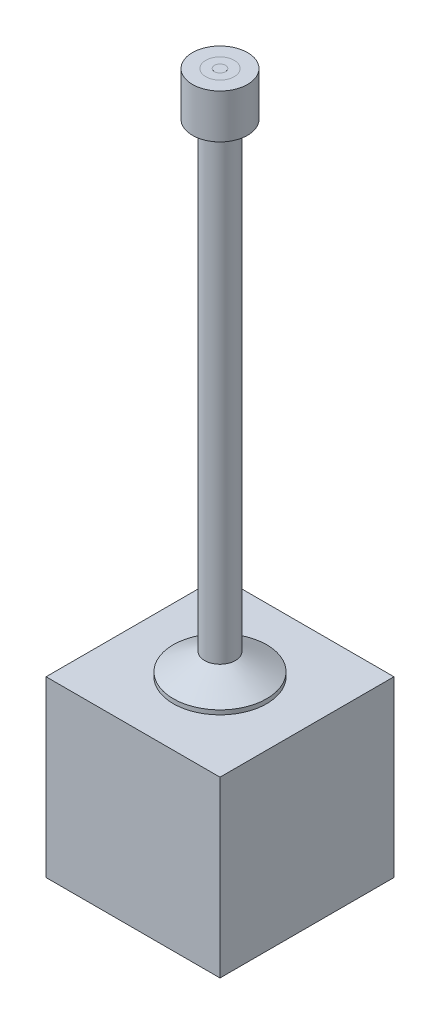
ISO-10303-21;
HEADER;
FILE_DESCRIPTION(('STEP AP214'),'2;1');
FILE_NAME('part.step','',(''),(''),'','','');
FILE_SCHEMA(('AUTOMOTIVE_DESIGN { 1 0 10303 214 1 1 1 1 }'));
ENDSEC;
DATA;
#1=APPLICATION_CONTEXT('core data for automotive mechanical design processes');
#2=APPLICATION_PROTOCOL_DEFINITION('international standard','automotive_design',2000,#1);
#3=PRODUCT_CONTEXT('',#1,'mechanical');
#4=PRODUCT('Part','Part','',(#3));
#5=PRODUCT_RELATED_PRODUCT_CATEGORY('part','',(#4));
#6=PRODUCT_DEFINITION_FORMATION('','',#4);
#7=PRODUCT_DEFINITION_CONTEXT('part definition',#1,'design');
#8=PRODUCT_DEFINITION('design','',#6,#7);
#9=PRODUCT_DEFINITION_SHAPE('','',#8);
#10=(LENGTH_UNIT() NAMED_UNIT(*) SI_UNIT(.MILLI.,.METRE.));
#11=(NAMED_UNIT(*) PLANE_ANGLE_UNIT() SI_UNIT($,.RADIAN.));
#12=(NAMED_UNIT(*) SI_UNIT($,.STERADIAN.) SOLID_ANGLE_UNIT());
#13=UNCERTAINTY_MEASURE_WITH_UNIT(LENGTH_MEASURE(1.E-05),#10,'distance_accuracy_value','');
#14=(GEOMETRIC_REPRESENTATION_CONTEXT(3) GLOBAL_UNCERTAINTY_ASSIGNED_CONTEXT((#13)) GLOBAL_UNIT_ASSIGNED_CONTEXT((#10,
#11,#12)) REPRESENTATION_CONTEXT('',''));
#15=CARTESIAN_POINT('',(0.,0.,0.));
#16=DIRECTION('',(0.,0.,1.));
#17=DIRECTION('',(1.,0.,0.));
#18=AXIS2_PLACEMENT_3D('',#15,#16,#17);
#19=CARTESIAN_POINT('',(10.,-20.,-10.));
#20=DIRECTION('',(-1.,0.,0.));
#21=DIRECTION('',(0.,-1.,0.));
#22=AXIS2_PLACEMENT_3D('',#19,#20,#21);
#23=PLANE('',#22);
#24=DIRECTION('',(0.,0.,1.));
#25=VECTOR('',#24,1.);
#26=CARTESIAN_POINT('',(10.,0.,-10.));
#27=LINE('',#26,#25);
#28=CARTESIAN_POINT('',(10.,0.,-10.));
#29=VERTEX_POINT('',#28);
#30=CARTESIAN_POINT('',(10.,0.,10.));
#31=VERTEX_POINT('',#30);
#32=EDGE_CURVE('E107',#29,#31,#27,.T.);
#33=ORIENTED_EDGE('',*,*,#32,.T.);
#34=DIRECTION('',(0.,1.,0.));
#35=VECTOR('',#34,1.);
#36=CARTESIAN_POINT('',(10.,-20.,10.));
#37=LINE('',#36,#35);
#38=CARTESIAN_POINT('',(10.,-20.,10.));
#39=VERTEX_POINT('',#38);
#40=EDGE_CURVE('E12',#39,#31,#37,.T.);
#41=ORIENTED_EDGE('',*,*,#40,.F.);
#42=DIRECTION('',(0.,0.,1.));
#43=VECTOR('',#42,1.);
#44=CARTESIAN_POINT('',(10.,-20.,-10.));
#45=LINE('',#44,#43);
#46=CARTESIAN_POINT('',(10.,-20.,-10.));
#47=VERTEX_POINT('',#46);
#48=EDGE_CURVE('E95',#47,#39,#45,.T.);
#49=ORIENTED_EDGE('',*,*,#48,.F.);
#50=DIRECTION('',(0.,1.,0.));
#51=VECTOR('',#50,1.);
#52=CARTESIAN_POINT('',(10.,-20.,-10.));
#53=LINE('',#52,#51);
#54=EDGE_CURVE('E103',#47,#29,#53,.T.);
#55=ORIENTED_EDGE('',*,*,#54,.T.);
#56=EDGE_LOOP('',(#33,#41,#49,#55));
#57=FACE_BOUND('',#56,.T.);
#58=ADVANCED_FACE('F44',(#57),#23,.F.);
#59=CARTESIAN_POINT('',(-10.,-20.,10.));
#60=DIRECTION('',(0.,0.,-1.));
#61=DIRECTION('',(-1.,0.,0.));
#62=AXIS2_PLACEMENT_3D('',#59,#60,#61);
#63=PLANE('',#62);
#64=DIRECTION('',(-1.,0.,0.));
#65=VECTOR('',#64,1.);
#66=CARTESIAN_POINT('',(-10.,0.,10.));
#67=LINE('',#66,#65);
#68=CARTESIAN_POINT('',(-10.,0.,10.));
#69=VERTEX_POINT('',#68);
#70=EDGE_CURVE('E99',#31,#69,#67,.T.);
#71=ORIENTED_EDGE('',*,*,#70,.T.);
#72=DIRECTION('',(0.,1.,0.));
#73=VECTOR('',#72,1.);
#74=CARTESIAN_POINT('',(-10.,-20.,10.));
#75=LINE('',#74,#73);
#76=CARTESIAN_POINT('',(-10.,-20.,10.));
#77=VERTEX_POINT('',#76);
#78=EDGE_CURVE('E52',#77,#69,#75,.T.);
#79=ORIENTED_EDGE('',*,*,#78,.F.);
#80=DIRECTION('',(-1.,0.,0.));
#81=VECTOR('',#80,1.);
#82=CARTESIAN_POINT('',(-10.,-20.,10.));
#83=LINE('',#82,#81);
#84=EDGE_CURVE('E90',#39,#77,#83,.T.);
#85=ORIENTED_EDGE('',*,*,#84,.F.);
#86=ORIENTED_EDGE('',*,*,#40,.T.);
#87=EDGE_LOOP('',(#71,#79,#85,#86));
#88=FACE_BOUND('',#87,.T.);
#89=ADVANCED_FACE('F98',(#88),#63,.F.);
#90=CARTESIAN_POINT('',(-10.,-20.,-10.));
#91=DIRECTION('',(1.,0.,0.));
#92=DIRECTION('',(0.,1.,0.));
#93=AXIS2_PLACEMENT_3D('',#90,#91,#92);
#94=PLANE('',#93);
#95=DIRECTION('',(0.,0.,-1.));
#96=VECTOR('',#95,1.);
#97=CARTESIAN_POINT('',(-10.,0.,-10.));
#98=LINE('',#97,#96);
#99=CARTESIAN_POINT('',(-10.,0.,-10.));
#100=VERTEX_POINT('',#99);
#101=EDGE_CURVE('E77',#69,#100,#98,.T.);
#102=ORIENTED_EDGE('',*,*,#101,.T.);
#103=DIRECTION('',(0.,1.,0.));
#104=VECTOR('',#103,1.);
#105=CARTESIAN_POINT('',(-10.,-20.,-10.));
#106=LINE('',#105,#104);
#107=CARTESIAN_POINT('',(-10.,-20.,-10.));
#108=VERTEX_POINT('',#107);
#109=EDGE_CURVE('E100',#108,#100,#106,.T.);
#110=ORIENTED_EDGE('',*,*,#109,.F.);
#111=DIRECTION('',(0.,0.,-1.));
#112=VECTOR('',#111,1.);
#113=CARTESIAN_POINT('',(-10.,-20.,-10.));
#114=LINE('',#113,#112);
#115=EDGE_CURVE('E93',#77,#108,#114,.T.);
#116=ORIENTED_EDGE('',*,*,#115,.F.);
#117=ORIENTED_EDGE('',*,*,#78,.T.);
#118=EDGE_LOOP('',(#102,#110,#116,#117));
#119=FACE_BOUND('',#118,.T.);
#120=ADVANCED_FACE('F101',(#119),#94,.F.);
#121=CARTESIAN_POINT('',(-10.,-20.,-10.));
#122=DIRECTION('',(0.,0.,1.));
#123=DIRECTION('',(1.,0.,0.));
#124=AXIS2_PLACEMENT_3D('',#121,#122,#123);
#125=PLANE('',#124);
#126=DIRECTION('',(1.,0.,0.));
#127=VECTOR('',#126,1.);
#128=CARTESIAN_POINT('',(-10.,0.,-10.));
#129=LINE('',#128,#127);
#130=EDGE_CURVE('E83',#100,#29,#129,.T.);
#131=ORIENTED_EDGE('',*,*,#130,.T.);
#132=ORIENTED_EDGE('',*,*,#54,.F.);
#133=DIRECTION('',(1.,0.,0.));
#134=VECTOR('',#133,1.);
#135=CARTESIAN_POINT('',(-10.,-20.,-10.));
#136=LINE('',#135,#134);
#137=EDGE_CURVE('E60',#108,#47,#136,.T.);
#138=ORIENTED_EDGE('',*,*,#137,.F.);
#139=ORIENTED_EDGE('',*,*,#109,.T.);
#140=EDGE_LOOP('',(#131,#132,#138,#139));
#141=FACE_BOUND('',#140,.T.);
#142=ADVANCED_FACE('F114',(#141),#125,.F.);
#143=CARTESIAN_POINT('',(0.,-20.,0.));
#144=DIRECTION('',(0.,1.,0.));
#145=DIRECTION('',(-1.,0.,0.));
#146=AXIS2_PLACEMENT_3D('',#143,#144,#145);
#147=PLANE('',#146);
#148=ORIENTED_EDGE('',*,*,#48,.T.);
#149=ORIENTED_EDGE('',*,*,#84,.T.);
#150=ORIENTED_EDGE('',*,*,#115,.T.);
#151=ORIENTED_EDGE('',*,*,#137,.T.);
#152=EDGE_LOOP('',(#148,#149,#150,#151));
#153=FACE_BOUND('',#152,.T.);
#154=ADVANCED_FACE('F91',(#153),#147,.F.);
#155=CARTESIAN_POINT('',(0.,0.,0.));
#156=DIRECTION('',(0.,1.,0.));
#157=DIRECTION('',(-1.,0.,0.));
#158=AXIS2_PLACEMENT_3D('',#155,#156,#157);
#159=PLANE('',#158);
#160=ORIENTED_EDGE('',*,*,#32,.F.);
#161=ORIENTED_EDGE('',*,*,#130,.F.);
#162=ORIENTED_EDGE('',*,*,#101,.F.);
#163=ORIENTED_EDGE('',*,*,#70,.F.);
#164=EDGE_LOOP('',(#160,#161,#162,#163));
#165=FACE_BOUND('',#164,.T.);
#166=ADVANCED_FACE('F117',(#165),#159,.T.);
#167=CLOSED_SHELL('',(#58,#89,#120,#142,#154,#166));
#168=MANIFOLD_SOLID_BREP('B2',#167);
#169=CARTESIAN_POINT('',(0.,55.5,0.));
#170=DIRECTION('',(0.,1.,0.));
#171=DIRECTION('',(0.,0.,1.));
#172=AXIS2_PLACEMENT_3D('',#169,#170,#171);
#173=CYLINDRICAL_SURFACE('',#172,0.375);
#174=CARTESIAN_POINT('',(0.,0.,0.));
#175=DIRECTION('',(0.,1.,0.));
#176=DIRECTION('',(0.,0.,1.));
#177=AXIS2_PLACEMENT_3D('',#174,#175,#176);
#178=CIRCLE('',#177,0.375);
#179=CARTESIAN_POINT('',(0.,0.,0.375));
#180=VERTEX_POINT('',#179);
#181=EDGE_CURVE('E197',#180,#180,#178,.T.);
#182=ORIENTED_EDGE('',*,*,#181,.F.);
#183=EDGE_LOOP('',(#182));
#184=FACE_BOUND('',#183,.T.);
#185=CARTESIAN_POINT('',(0.,54.9421933085502,0.));
#186=DIRECTION('',(0.,1.,0.));
#187=DIRECTION('',(0.,0.,1.));
#188=AXIS2_PLACEMENT_3D('',#185,#186,#187);
#189=CIRCLE('',#188,0.375);
#190=CARTESIAN_POINT('',(0.,54.9421933085502,0.375));
#191=VERTEX_POINT('',#190);
#192=EDGE_CURVE('E43',#191,#191,#189,.T.);
#193=ORIENTED_EDGE('',*,*,#192,.T.);
#194=EDGE_LOOP('',(#193));
#195=FACE_BOUND('',#194,.T.);
#196=ADVANCED_FACE('F175',(#184,#195),#173,.F.);
#197=CARTESIAN_POINT('',(0.,60.571,0.));
#198=DIRECTION('',(0.,1.,0.));
#199=DIRECTION('',(0.,0.,1.));
#200=AXIS2_PLACEMENT_3D('',#197,#198,#199);
#201=CONICAL_SURFACE('',#200,0.635000000000092,0.0461581536129454);
#202=ORIENTED_EDGE('',*,*,#192,.F.);
#203=EDGE_LOOP('',(#202));
#204=FACE_BOUND('',#203,.T.);
#205=CARTESIAN_POINT('',(0.,60.571,0.));
#206=DIRECTION('',(0.,1.,0.));
#207=DIRECTION('',(0.,0.,1.));
#208=AXIS2_PLACEMENT_3D('',#205,#206,#207);
#209=CIRCLE('',#208,0.635000000000092);
#210=CARTESIAN_POINT('',(0.,60.571,0.635000000000092));
#211=VERTEX_POINT('',#210);
#212=EDGE_CURVE('E181',#211,#211,#209,.T.);
#213=ORIENTED_EDGE('',*,*,#212,.T.);
#214=EDGE_LOOP('',(#213));
#215=FACE_BOUND('',#214,.T.);
#216=ADVANCED_FACE('F204',(#204,#215),#201,.F.);
#217=CARTESIAN_POINT('',(0.635000000000092,60.571,0.));
#218=DIRECTION('',(0.,-1.,0.));
#219=DIRECTION('',(0.,0.,-1.));
#220=AXIS2_PLACEMENT_3D('',#217,#218,#219);
#221=PLANE('',#220);
#222=ORIENTED_EDGE('',*,*,#212,.F.);
#223=EDGE_LOOP('',(#222));
#224=FACE_BOUND('',#223,.T.);
#225=CARTESIAN_POINT('',(0.,60.571,0.));
#226=DIRECTION('',(0.,1.,0.));
#227=DIRECTION('',(0.,0.,1.));
#228=AXIS2_PLACEMENT_3D('',#225,#226,#227);
#229=CIRCLE('',#228,1.63500000000009);
#230=CARTESIAN_POINT('',(0.,60.571,1.63500000000009));
#231=VERTEX_POINT('',#230);
#232=EDGE_CURVE('E185',#231,#231,#229,.T.);
#233=ORIENTED_EDGE('',*,*,#232,.T.);
#234=EDGE_LOOP('',(#233));
#235=FACE_BOUND('',#234,.T.);
#236=ADVANCED_FACE('F208',(#224,#235),#221,.F.);
#237=CARTESIAN_POINT('',(0.,54.9421933085502,0.));
#238=DIRECTION('',(0.,1.,0.));
#239=DIRECTION('',(0.,0.,1.));
#240=AXIS2_PLACEMENT_3D('',#237,#238,#239);
#241=CONICAL_SURFACE('',#240,1.37500000000001,0.0461581536129434);
#242=ORIENTED_EDGE('',*,*,#232,.F.);
#243=EDGE_LOOP('',(#242));
#244=FACE_BOUND('',#243,.T.);
#245=CARTESIAN_POINT('',(0.,54.9421933085502,0.));
#246=DIRECTION('',(0.,1.,0.));
#247=DIRECTION('',(0.,0.,1.));
#248=AXIS2_PLACEMENT_3D('',#245,#246,#247);
#249=CIRCLE('',#248,1.37500000000001);
#250=CARTESIAN_POINT('',(0.,54.9421933085502,1.37500000000001));
#251=VERTEX_POINT('',#250);
#252=EDGE_CURVE('E189',#251,#251,#249,.T.);
#253=ORIENTED_EDGE('',*,*,#252,.T.);
#254=EDGE_LOOP('',(#253));
#255=FACE_BOUND('',#254,.T.);
#256=ADVANCED_FACE('F213',(#244,#255),#241,.T.);
#257=CARTESIAN_POINT('',(0.,55.5,0.));
#258=DIRECTION('',(0.,1.,0.));
#259=DIRECTION('',(0.,0.,1.));
#260=AXIS2_PLACEMENT_3D('',#257,#258,#259);
#261=CYLINDRICAL_SURFACE('',#260,1.37500000000001);
#262=ORIENTED_EDGE('',*,*,#252,.F.);
#263=EDGE_LOOP('',(#262));
#264=FACE_BOUND('',#263,.T.);
#265=CARTESIAN_POINT('',(0.,0.,0.));
#266=DIRECTION('',(0.,1.,0.));
#267=DIRECTION('',(0.,0.,1.));
#268=AXIS2_PLACEMENT_3D('',#265,#266,#267);
#269=CIRCLE('',#268,1.37500000000001);
#270=CARTESIAN_POINT('',(0.,0.,1.37500000000001));
#271=VERTEX_POINT('',#270);
#272=EDGE_CURVE('E194',#271,#271,#269,.T.);
#273=ORIENTED_EDGE('',*,*,#272,.T.);
#274=EDGE_LOOP('',(#273));
#275=FACE_BOUND('',#274,.T.);
#276=ADVANCED_FACE('F219',(#264,#275),#261,.T.);
#277=CARTESIAN_POINT('',(0.375,0.,0.));
#278=DIRECTION('',(0.,1.,0.));
#279=DIRECTION('',(0.,0.,1.));
#280=AXIS2_PLACEMENT_3D('',#277,#278,#279);
#281=PLANE('',#280);
#282=ORIENTED_EDGE('',*,*,#272,.F.);
#283=EDGE_LOOP('',(#282));
#284=FACE_BOUND('',#283,.T.);
#285=ORIENTED_EDGE('',*,*,#181,.T.);
#286=EDGE_LOOP('',(#285));
#287=FACE_BOUND('',#286,.T.);
#288=ADVANCED_FACE('F201',(#284,#287),#281,.F.);
#289=CLOSED_SHELL('',(#196,#216,#236,#256,#276,#288));
#290=MANIFOLD_SOLID_BREP('B6',#289);
#291=CARTESIAN_POINT('',(1.37500000000001,0.,0.));
#292=DIRECTION('',(0.,1.,0.));
#293=DIRECTION('',(-1.,0.,0.));
#294=AXIS2_PLACEMENT_3D('',#291,#292,#293);
#295=PLANE('',#294);
#296=CARTESIAN_POINT('',(0.,0.,0.));
#297=DIRECTION('',(0.,1.,0.));
#298=DIRECTION('',(-1.,0.,0.));
#299=AXIS2_PLACEMENT_3D('',#296,#297,#298);
#300=CIRCLE('',#299,5.375);
#301=CARTESIAN_POINT('',(-5.375,0.,0.));
#302=VERTEX_POINT('',#301);
#303=EDGE_CURVE('E174',#302,#302,#300,.T.);
#304=ORIENTED_EDGE('',*,*,#303,.F.);
#305=EDGE_LOOP('',(#304));
#306=FACE_BOUND('',#305,.T.);
#307=CARTESIAN_POINT('',(0.,0.,0.));
#308=DIRECTION('',(0.,1.,0.));
#309=DIRECTION('',(-1.,0.,0.));
#310=AXIS2_PLACEMENT_3D('',#307,#308,#309);
#311=CIRCLE('',#310,1.37500000000001);
#312=CARTESIAN_POINT('',(-1.37500000000001,0.,0.));
#313=VERTEX_POINT('',#312);
#314=EDGE_CURVE('E317',#313,#313,#311,.T.);
#315=ORIENTED_EDGE('',*,*,#314,.T.);
#316=EDGE_LOOP('',(#315));
#317=FACE_BOUND('',#316,.T.);
#318=ADVANCED_FACE('F286',(#306,#317),#295,.F.);
#319=CARTESIAN_POINT('',(0.,60.571,0.));
#320=DIRECTION('',(0.,1.,0.));
#321=DIRECTION('',(-1.,0.,0.));
#322=AXIS2_PLACEMENT_3D('',#319,#320,#321);
#323=CYLINDRICAL_SURFACE('',#322,5.375);
#324=CARTESIAN_POINT('',(0.,0.5,0.));
#325=DIRECTION('',(0.,1.,0.));
#326=DIRECTION('',(-1.,0.,0.));
#327=AXIS2_PLACEMENT_3D('',#324,#325,#326);
#328=CIRCLE('',#327,5.375);
#329=CARTESIAN_POINT('',(5.375,0.500000000000001,0.));
#330=VERTEX_POINT('',#329);
#331=EDGE_CURVE('E292',#330,#330,#328,.T.);
#332=ORIENTED_EDGE('',*,*,#331,.F.);
#333=EDGE_LOOP('',(#332));
#334=FACE_BOUND('',#333,.T.);
#335=ORIENTED_EDGE('',*,*,#303,.T.);
#336=EDGE_LOOP('',(#335));
#337=FACE_BOUND('',#336,.T.);
#338=ADVANCED_FACE('F360',(#334,#337),#323,.T.);
#339=CARTESIAN_POINT('',(0.,0.5,0.));
#340=DIRECTION('',(0.,-1.,0.));
#341=DIRECTION('',(1.,0.,0.));
#342=AXIS2_PLACEMENT_3D('',#339,#340,#341);
#343=CONICAL_SURFACE('',#342,5.375,1.06310757338599);
#344=CARTESIAN_POINT('',(0.,2.5,0.));
#345=DIRECTION('',(0.,1.,0.));
#346=DIRECTION('',(-1.,0.,0.));
#347=AXIS2_PLACEMENT_3D('',#344,#345,#346);
#348=CIRCLE('',#347,1.78);
#349=CARTESIAN_POINT('',(1.78,2.5,0.));
#350=VERTEX_POINT('',#349);
#351=EDGE_CURVE('E296',#350,#350,#348,.T.);
#352=CARTESIAN_POINT('',(1.78,2.5,0.));
#353=CARTESIAN_POINT('',(1.81744791666667,2.47916666666667,0.));
#354=CARTESIAN_POINT('',(1.85489583333333,2.45833333333334,0.));
#355=CARTESIAN_POINT('',(1.92979166666667,2.41666666666667,0.));
#356=CARTESIAN_POINT('',(1.96723958333333,2.39583333333334,0.));
#357=CARTESIAN_POINT('',(2.04213541666667,2.35416666666667,0.));
#358=CARTESIAN_POINT('',(2.07958333333333,2.33333333333334,0.));
#359=CARTESIAN_POINT('',(2.15447916666667,2.29166666666667,0.));
#360=CARTESIAN_POINT('',(2.19192708333333,2.27083333333334,0.));
#361=CARTESIAN_POINT('',(2.26682291666667,2.22916666666667,0.));
#362=CARTESIAN_POINT('',(2.30427083333333,2.20833333333334,0.));
#363=CARTESIAN_POINT('',(2.37916666666667,2.16666666666667,0.));
#364=CARTESIAN_POINT('',(2.41661458333333,2.14583333333334,0.));
#365=CARTESIAN_POINT('',(2.49151041666667,2.10416666666667,0.));
#366=CARTESIAN_POINT('',(2.52895833333333,2.08333333333334,0.));
#367=CARTESIAN_POINT('',(2.60385416666667,2.04166666666667,0.));
#368=CARTESIAN_POINT('',(2.64130208333333,2.02083333333333,0.));
#369=CARTESIAN_POINT('',(2.71619791666667,1.97916666666667,0.));
#370=CARTESIAN_POINT('',(2.75364583333333,1.95833333333334,0.));
#371=CARTESIAN_POINT('',(2.82854166666667,1.91666666666667,0.));
#372=CARTESIAN_POINT('',(2.86598958333333,1.89583333333334,0.));
#373=CARTESIAN_POINT('',(2.94088541666667,1.85416666666667,0.));
#374=CARTESIAN_POINT('',(2.97833333333333,1.83333333333334,0.));
#375=CARTESIAN_POINT('',(3.05322916666667,1.79166666666667,0.));
#376=CARTESIAN_POINT('',(3.09067708333333,1.77083333333334,0.));
#377=CARTESIAN_POINT('',(3.16557291666667,1.72916666666667,0.));
#378=CARTESIAN_POINT('',(3.20302083333333,1.70833333333333,0.));
#379=CARTESIAN_POINT('',(3.27791666666667,1.66666666666667,0.));
#380=CARTESIAN_POINT('',(3.31536458333333,1.64583333333333,0.));
#381=CARTESIAN_POINT('',(3.39026041666667,1.60416666666667,0.));
#382=CARTESIAN_POINT('',(3.42770833333333,1.58333333333333,0.));
#383=CARTESIAN_POINT('',(3.50260416666667,1.54166666666667,0.));
#384=CARTESIAN_POINT('',(3.54005208333333,1.52083333333333,0.));
#385=CARTESIAN_POINT('',(3.61494791666667,1.47916666666667,0.));
#386=CARTESIAN_POINT('',(3.65239583333333,1.45833333333333,0.));
#387=CARTESIAN_POINT('',(3.72729166666667,1.41666666666667,0.));
#388=CARTESIAN_POINT('',(3.76473958333333,1.39583333333333,0.));
#389=CARTESIAN_POINT('',(3.83963541666667,1.35416666666667,0.));
#390=CARTESIAN_POINT('',(3.87708333333333,1.33333333333333,0.));
#391=CARTESIAN_POINT('',(3.95197916666667,1.29166666666667,0.));
#392=CARTESIAN_POINT('',(3.98942708333333,1.27083333333333,0.));
#393=CARTESIAN_POINT('',(4.06432291666667,1.22916666666667,0.));
#394=CARTESIAN_POINT('',(4.10177083333333,1.20833333333333,0.));
#395=CARTESIAN_POINT('',(4.17666666666667,1.16666666666667,0.));
#396=CARTESIAN_POINT('',(4.21411458333333,1.14583333333333,0.));
#397=CARTESIAN_POINT('',(4.28901041666667,1.10416666666667,0.));
#398=CARTESIAN_POINT('',(4.32645833333333,1.08333333333333,0.));
#399=CARTESIAN_POINT('',(4.40135416666667,1.04166666666667,0.));
#400=CARTESIAN_POINT('',(4.43880208333333,1.02083333333333,0.));
#401=CARTESIAN_POINT('',(4.51369791666667,0.979166666666668,0.));
#402=CARTESIAN_POINT('',(4.55114583333333,0.958333333333334,0.));
#403=CARTESIAN_POINT('',(4.62604166666667,0.916666666666667,0.));
#404=CARTESIAN_POINT('',(4.66348958333333,0.895833333333334,0.));
#405=CARTESIAN_POINT('',(4.73838541666667,0.854166666666667,0.));
#406=CARTESIAN_POINT('',(4.77583333333333,0.833333333333334,0.));
#407=CARTESIAN_POINT('',(4.85072916666667,0.791666666666667,0.));
#408=CARTESIAN_POINT('',(4.88817708333333,0.770833333333334,0.));
#409=CARTESIAN_POINT('',(4.96307291666667,0.729166666666667,0.));
#410=CARTESIAN_POINT('',(5.00052083333333,0.708333333333334,0.));
#411=CARTESIAN_POINT('',(5.07541666666667,0.666666666666667,0.));
#412=CARTESIAN_POINT('',(5.11286458333333,0.645833333333334,0.));
#413=CARTESIAN_POINT('',(5.18776041666667,0.604166666666667,0.));
#414=CARTESIAN_POINT('',(5.22520833333333,0.583333333333334,0.));
#415=CARTESIAN_POINT('',(5.30010416666667,0.541666666666667,0.));
#416=CARTESIAN_POINT('',(5.33755208333333,0.520833333333334,0.));
#417=CARTESIAN_POINT('',(5.375,0.5,0.));
#418=B_SPLINE_CURVE_WITH_KNOTS('',3,(#352,#353,#354,#355,#356,#357,#358,#359,#360,#361,#362,
#363,#364,#365,#366,#367,#368,#369,#370,#371,#372,#373,#374,#375,#376,#377,#378,#379,#380,#381,
#382,#383,#384,#385,#386,#387,#388,#389,#390,#391,#392,#393,#394,#395,#396,#397,#398,#399,#400,
#401,#402,#403,#404,#405,#406,#407,#408,#409,#410,#411,#412,#413,#414,#415,#416,#417),
.UNSPECIFIED.,.F.,.F.,(4,2,2,2,2,2,2,2,2,2,2,2,2,2,2,2,2,2,2,2,2,2,2,2,2,2,2,2,2,2,2,2,4),(0.,
0.128558812082496,0.257117624164992,0.385676436247487,0.514235248329983,0.642794060412479,
0.771352872494975,0.899911684577471,1.02847049665997,1.15702930874246,1.28558812082496,
1.41414693290746,1.54270574498995,1.67126455707245,1.79982336915494,1.92838218123744,
2.05694099331993,2.18549980540243,2.31405861748493,2.44261742956742,2.57117624164992,
2.69973505373241,2.82829386581491,2.9568526778974,3.0854114899799,3.2139703020624,
3.34252911414489,3.47108792622739,3.59964673830988,3.72820555039238,3.85676436247488,
3.98532317455737,4.11388198663987),.UNSPECIFIED.);
#419=EDGE_CURVE('BSEAM355',#350,#330,#418,.T.);
#420=ORIENTED_EDGE('',*,*,#351,.F.);
#421=ORIENTED_EDGE('',*,*,#331,.T.);
#422=ORIENTED_EDGE('',*,*,#419,.T.);
#423=ORIENTED_EDGE('',*,*,#419,.F.);
#424=EDGE_LOOP('',(#420,#422,#421,#423));
#425=FACE_BOUND('',#424,.T.);
#426=ADVANCED_FACE('F355',(#425),#343,.T.);
#427=CARTESIAN_POINT('',(0.,60.571,0.));
#428=DIRECTION('',(0.,1.,0.));
#429=DIRECTION('',(-1.,0.,0.));
#430=AXIS2_PLACEMENT_3D('',#427,#428,#429);
#431=CYLINDRICAL_SURFACE('',#430,1.78);
#432=CARTESIAN_POINT('',(0.,54.5,0.));
#433=DIRECTION('',(0.,1.,0.));
#434=DIRECTION('',(-1.,0.,0.));
#435=AXIS2_PLACEMENT_3D('',#432,#433,#434);
#436=CIRCLE('',#435,1.78);
#437=CARTESIAN_POINT('',(-1.78,54.5,0.));
#438=VERTEX_POINT('',#437);
#439=EDGE_CURVE('E300',#438,#438,#436,.T.);
#440=ORIENTED_EDGE('',*,*,#439,.F.);
#441=EDGE_LOOP('',(#440));
#442=FACE_BOUND('',#441,.T.);
#443=ORIENTED_EDGE('',*,*,#351,.T.);
#444=EDGE_LOOP('',(#443));
#445=FACE_BOUND('',#444,.T.);
#446=ADVANCED_FACE('F349',(#442,#445),#431,.T.);
#447=CARTESIAN_POINT('',(0.,54.5,0.));
#448=DIRECTION('',(0.,1.,0.));
#449=DIRECTION('',(-1.,0.,0.));
#450=AXIS2_PLACEMENT_3D('',#447,#448,#449);
#451=CONICAL_SURFACE('',#450,1.78,0.947760988153379);
#452=CARTESIAN_POINT('',(0.,55.5,0.));
#453=DIRECTION('',(0.,1.,0.));
#454=DIRECTION('',(-1.,0.,0.));
#455=AXIS2_PLACEMENT_3D('',#452,#453,#454);
#456=CIRCLE('',#455,3.17178589149484);
#457=CARTESIAN_POINT('',(-3.17178589149484,55.5,0.));
#458=VERTEX_POINT('',#457);
#459=EDGE_CURVE('E305',#458,#458,#456,.T.);
#460=ORIENTED_EDGE('',*,*,#459,.F.);
#461=EDGE_LOOP('',(#460));
#462=FACE_BOUND('',#461,.T.);
#463=ORIENTED_EDGE('',*,*,#439,.T.);
#464=EDGE_LOOP('',(#463));
#465=FACE_BOUND('',#464,.T.);
#466=ADVANCED_FACE('F343',(#462,#465),#451,.T.);
#467=CARTESIAN_POINT('',(0.,60.571,0.));
#468=DIRECTION('',(0.,1.,0.));
#469=DIRECTION('',(-1.,0.,0.));
#470=AXIS2_PLACEMENT_3D('',#467,#468,#469);
#471=CYLINDRICAL_SURFACE('',#470,3.17178589149484);
#472=CARTESIAN_POINT('',(0.,60.571,0.));
#473=DIRECTION('',(0.,1.,0.));
#474=DIRECTION('',(-1.,0.,0.));
#475=AXIS2_PLACEMENT_3D('',#472,#473,#474);
#476=CIRCLE('',#475,3.17178589149484);
#477=CARTESIAN_POINT('',(-3.17178589149484,60.571,0.));
#478=VERTEX_POINT('',#477);
#479=EDGE_CURVE('E308',#478,#478,#476,.T.);
#480=ORIENTED_EDGE('',*,*,#479,.F.);
#481=EDGE_LOOP('',(#480));
#482=FACE_BOUND('',#481,.T.);
#483=ORIENTED_EDGE('',*,*,#459,.T.);
#484=EDGE_LOOP('',(#483));
#485=FACE_BOUND('',#484,.T.);
#486=ADVANCED_FACE('F337',(#482,#485),#471,.T.);
#487=CARTESIAN_POINT('',(3.17178589149484,60.571,0.));
#488=DIRECTION('',(0.,-1.,0.));
#489=DIRECTION('',(1.,0.,0.));
#490=AXIS2_PLACEMENT_3D('',#487,#488,#489);
#491=PLANE('',#490);
#492=CARTESIAN_POINT('',(0.,60.571,0.));
#493=DIRECTION('',(0.,1.,0.));
#494=DIRECTION('',(-1.,0.,0.));
#495=AXIS2_PLACEMENT_3D('',#492,#493,#494);
#496=CIRCLE('',#495,1.63500000000009);
#497=CARTESIAN_POINT('',(-1.63500000000009,60.571,0.));
#498=VERTEX_POINT('',#497);
#499=EDGE_CURVE('E311',#498,#498,#496,.T.);
#500=ORIENTED_EDGE('',*,*,#499,.F.);
#501=EDGE_LOOP('',(#500));
#502=FACE_BOUND('',#501,.T.);
#503=ORIENTED_EDGE('',*,*,#479,.T.);
#504=EDGE_LOOP('',(#503));
#505=FACE_BOUND('',#504,.T.);
#506=ADVANCED_FACE('F331',(#502,#505),#491,.F.);
#507=CARTESIAN_POINT('',(0.,60.571,0.));
#508=DIRECTION('',(0.,1.,0.));
#509=DIRECTION('',(-1.,0.,0.));
#510=AXIS2_PLACEMENT_3D('',#507,#508,#509);
#511=CONICAL_SURFACE('',#510,1.63500000000009,0.0461581536129434);
#512=CARTESIAN_POINT('',(0.,54.9421933085502,0.));
#513=DIRECTION('',(0.,1.,0.));
#514=DIRECTION('',(-1.,0.,0.));
#515=AXIS2_PLACEMENT_3D('',#512,#513,#514);
#516=CIRCLE('',#515,1.37500000000001);
#517=CARTESIAN_POINT('',(-1.37500000000001,54.9421933085502,0.));
#518=VERTEX_POINT('',#517);
#519=EDGE_CURVE('E314',#518,#518,#516,.T.);
#520=ORIENTED_EDGE('',*,*,#519,.F.);
#521=EDGE_LOOP('',(#520));
#522=FACE_BOUND('',#521,.T.);
#523=ORIENTED_EDGE('',*,*,#499,.T.);
#524=EDGE_LOOP('',(#523));
#525=FACE_BOUND('',#524,.T.);
#526=ADVANCED_FACE('F325',(#522,#525),#511,.F.);
#527=CARTESIAN_POINT('',(0.,60.571,0.));
#528=DIRECTION('',(0.,1.,0.));
#529=DIRECTION('',(-1.,0.,0.));
#530=AXIS2_PLACEMENT_3D('',#527,#528,#529);
#531=CYLINDRICAL_SURFACE('',#530,1.37500000000001);
#532=ORIENTED_EDGE('',*,*,#314,.F.);
#533=EDGE_LOOP('',(#532));
#534=FACE_BOUND('',#533,.T.);
#535=ORIENTED_EDGE('',*,*,#519,.T.);
#536=EDGE_LOOP('',(#535));
#537=FACE_BOUND('',#536,.T.);
#538=ADVANCED_FACE('F322',(#534,#537),#531,.F.);
#539=CLOSED_SHELL('',(#318,#338,#426,#446,#466,#486,#506,#526,#538));
#540=MANIFOLD_SOLID_BREP('B38',#539);
#541=CARTESIAN_POINT('',(0.63500000000009,60.571,0.));
#542=DIRECTION('',(0.,-1.,0.));
#543=DIRECTION('',(1.,0.,0.));
#544=AXIS2_PLACEMENT_3D('',#541,#542,#543);
#545=PLANE('',#544);
#546=CARTESIAN_POINT('',(0.,60.571,0.));
#547=DIRECTION('',(0.,1.,0.));
#548=DIRECTION('',(-1.,0.,0.));
#549=AXIS2_PLACEMENT_3D('',#546,#547,#548);
#550=CIRCLE('',#549,0.63500000000009);
#551=CARTESIAN_POINT('',(-0.63500000000009,60.571,0.));
#552=VERTEX_POINT('',#551);
#553=EDGE_CURVE('E285',#552,#552,#550,.T.);
#554=ORIENTED_EDGE('',*,*,#553,.T.);
#555=EDGE_LOOP('',(#554));
#556=FACE_BOUND('',#555,.T.);
#557=ADVANCED_FACE('F426',(#556),#545,.F.);
#558=CARTESIAN_POINT('',(0.,54.9421933085502,0.));
#559=DIRECTION('',(0.,1.,0.));
#560=DIRECTION('',(-1.,0.,0.));
#561=AXIS2_PLACEMENT_3D('',#558,#559,#560);
#562=CONICAL_SURFACE('',#561,0.375,0.0461581536129451);
#563=ORIENTED_EDGE('',*,*,#553,.F.);
#564=EDGE_LOOP('',(#563));
#565=FACE_BOUND('',#564,.T.);
#566=CARTESIAN_POINT('',(0.,54.9421933085502,0.));
#567=DIRECTION('',(0.,1.,0.));
#568=DIRECTION('',(-1.,0.,0.));
#569=AXIS2_PLACEMENT_3D('',#566,#567,#568);
#570=CIRCLE('',#569,0.375);
#571=CARTESIAN_POINT('',(-0.375,54.9421933085502,0.));
#572=VERTEX_POINT('',#571);
#573=EDGE_CURVE('E432',#572,#572,#570,.T.);
#574=ORIENTED_EDGE('',*,*,#573,.T.);
#575=EDGE_LOOP('',(#574));
#576=FACE_BOUND('',#575,.T.);
#577=ADVANCED_FACE('F451',(#565,#576),#562,.T.);
#578=CARTESIAN_POINT('',(0.,60.571,0.));
#579=DIRECTION('',(0.,1.,0.));
#580=DIRECTION('',(-1.,0.,0.));
#581=AXIS2_PLACEMENT_3D('',#578,#579,#580);
#582=CYLINDRICAL_SURFACE('',#581,0.375);
#583=ORIENTED_EDGE('',*,*,#573,.F.);
#584=EDGE_LOOP('',(#583));
#585=FACE_BOUND('',#584,.T.);
#586=CARTESIAN_POINT('',(0.,0.,0.));
#587=DIRECTION('',(0.,1.,0.));
#588=DIRECTION('',(-1.,0.,0.));
#589=AXIS2_PLACEMENT_3D('',#586,#587,#588);
#590=CIRCLE('',#589,0.375);
#591=CARTESIAN_POINT('',(-0.375,0.,0.));
#592=VERTEX_POINT('',#591);
#593=EDGE_CURVE('E436',#592,#592,#590,.T.);
#594=ORIENTED_EDGE('',*,*,#593,.T.);
#595=EDGE_LOOP('',(#594));
#596=FACE_BOUND('',#595,.T.);
#597=ADVANCED_FACE('F443',(#585,#596),#582,.T.);
#598=CARTESIAN_POINT('',(0.375,0.,0.));
#599=DIRECTION('',(0.,1.,0.));
#600=DIRECTION('',(-1.,0.,0.));
#601=AXIS2_PLACEMENT_3D('',#598,#599,#600);
#602=PLANE('',#601);
#603=ORIENTED_EDGE('',*,*,#593,.F.);
#604=EDGE_LOOP('',(#603));
#605=FACE_BOUND('',#604,.T.);
#606=ADVANCED_FACE('F445',(#605),#602,.F.);
#607=CLOSED_SHELL('',(#557,#577,#597,#606));
#608=MANIFOLD_SOLID_BREP('B169',#607);
#609=ADVANCED_BREP_SHAPE_REPRESENTATION('',(#18,#168,#290,#540,#608),#14);
#610=SHAPE_DEFINITION_REPRESENTATION(#9,#609);
ENDSEC;
END-ISO-10303-21;
